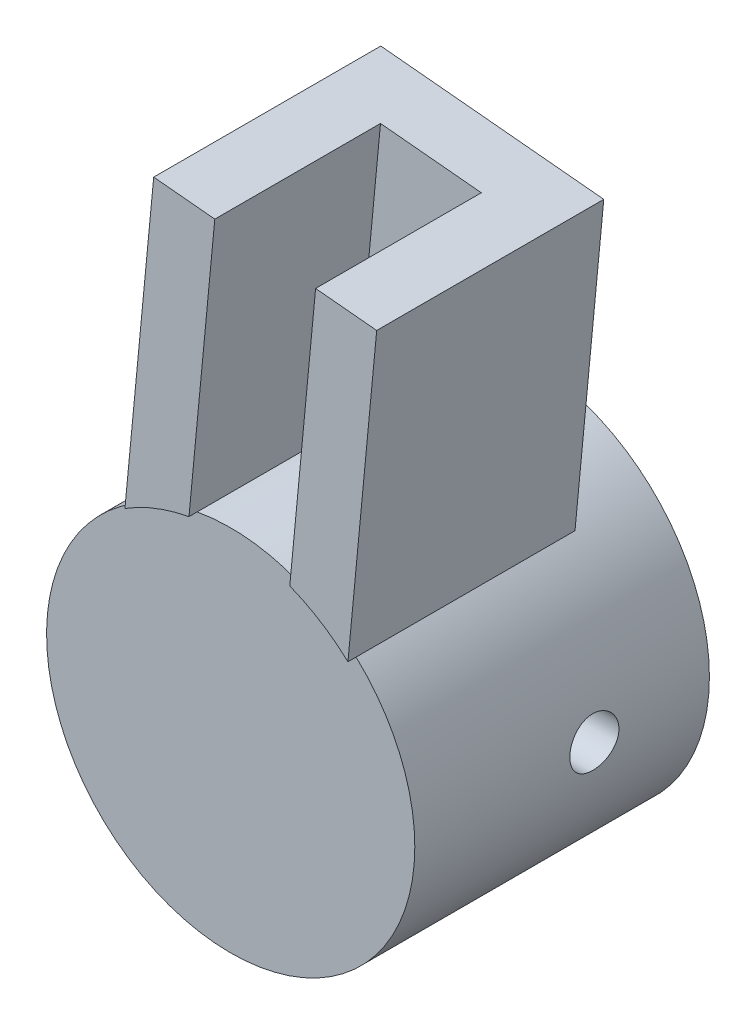
ISO-10303-21;
HEADER;
FILE_DESCRIPTION(('STEP AP214'),'2;1');
FILE_NAME('part.step','',(''),(''),'','','');
FILE_SCHEMA(('AUTOMOTIVE_DESIGN { 1 0 10303 214 1 1 1 1 }'));
ENDSEC;
DATA;
#1=APPLICATION_CONTEXT('core data for automotive mechanical design processes');
#2=APPLICATION_PROTOCOL_DEFINITION('international standard','automotive_design',2000,#1);
#3=PRODUCT_CONTEXT('',#1,'mechanical');
#4=PRODUCT('Part','Part','',(#3));
#5=PRODUCT_RELATED_PRODUCT_CATEGORY('part','',(#4));
#6=PRODUCT_DEFINITION_FORMATION('','',#4);
#7=PRODUCT_DEFINITION_CONTEXT('part definition',#1,'design');
#8=PRODUCT_DEFINITION('design','',#6,#7);
#9=PRODUCT_DEFINITION_SHAPE('','',#8);
#10=(LENGTH_UNIT() NAMED_UNIT(*) SI_UNIT(.MILLI.,.METRE.));
#11=(NAMED_UNIT(*) PLANE_ANGLE_UNIT() SI_UNIT($,.RADIAN.));
#12=(NAMED_UNIT(*) SI_UNIT($,.STERADIAN.) SOLID_ANGLE_UNIT());
#13=UNCERTAINTY_MEASURE_WITH_UNIT(LENGTH_MEASURE(1.E-05),#10,'distance_accuracy_value','');
#14=(GEOMETRIC_REPRESENTATION_CONTEXT(3) GLOBAL_UNCERTAINTY_ASSIGNED_CONTEXT((#13)) GLOBAL_UNIT_ASSIGNED_CONTEXT((#10,
#11,#12)) REPRESENTATION_CONTEXT('',''));
#15=CARTESIAN_POINT('',(0.,0.,0.));
#16=DIRECTION('',(0.,0.,1.));
#17=DIRECTION('',(1.,0.,0.));
#18=AXIS2_PLACEMENT_3D('',#15,#16,#17);
#19=CARTESIAN_POINT('',(0.,0.,-15.));
#20=DIRECTION('',(0.,0.,1.));
#21=DIRECTION('',(1.,0.,0.));
#22=AXIS2_PLACEMENT_3D('',#19,#20,#21);
#23=CYLINDRICAL_SURFACE('',#22,12.);
#24=DIRECTION('',(0.,0.,1.));
#25=VECTOR('',#24,1.);
#26=CARTESIAN_POINT('',(8.1720854308341,8.78732153225025,-15.));
#27=LINE('',#26,#25);
#28=CARTESIAN_POINT('',(8.1720854308341,8.78732153225025,4.2));
#29=VERTEX_POINT('',#28);
#30=CARTESIAN_POINT('',(8.1720854308341,8.78732153225026,-10.0688828783374));
#31=VERTEX_POINT('',#30);
#32=EDGE_CURVE('E325',#29,#31,#27,.F.);
#33=ORIENTED_EDGE('',*,*,#32,.F.);
#34=CARTESIAN_POINT('',(0.,0.,4.2));
#35=DIRECTION('',(0.,0.,1.));
#36=DIRECTION('',(1.,0.,0.));
#37=AXIS2_PLACEMENT_3D('',#34,#35,#36);
#38=CIRCLE('',#37,12.);
#39=CARTESIAN_POINT('',(-6.36183471373267,10.1748247687685,4.2));
#40=VERTEX_POINT('',#39);
#41=EDGE_CURVE('E276',#40,#29,#38,.T.);
#42=ORIENTED_EDGE('',*,*,#41,.F.);
#43=DIRECTION('',(0.,0.,1.));
#44=VECTOR('',#43,1.);
#45=CARTESIAN_POINT('',(-6.36183471373267,10.1748247687685,-15.));
#46=LINE('',#45,#44);
#47=CARTESIAN_POINT('',(-6.36183471373267,10.1748247687685,-10.0688828783374));
#48=VERTEX_POINT('',#47);
#49=EDGE_CURVE('E62',#48,#40,#46,.T.);
#50=ORIENTED_EDGE('',*,*,#49,.F.);
#51=CARTESIAN_POINT('',(0.,0.,-10.0688828783374));
#52=DIRECTION('',(0.,0.,1.));
#53=DIRECTION('',(0.,-1.,0.));
#54=AXIS2_PLACEMENT_3D('',#51,#52,#53);
#55=CIRCLE('',#54,12.);
#56=EDGE_CURVE('E324',#31,#48,#55,.T.);
#57=ORIENTED_EDGE('',*,*,#56,.F.);
#58=EDGE_LOOP('',(#33,#42,#50,#57));
#59=FACE_BOUND('',#58,.T.);
#60=CARTESIAN_POINT('',(0.,0.,-15.));
#61=DIRECTION('',(0.,0.,1.));
#62=DIRECTION('',(1.,0.,0.));
#63=AXIS2_PLACEMENT_3D('',#60,#61,#62);
#64=CIRCLE('',#63,12.);
#65=CARTESIAN_POINT('',(12.,0.,-15.));
#66=VERTEX_POINT('',#65);
#67=EDGE_CURVE('E48',#66,#66,#64,.T.);
#68=ORIENTED_EDGE('',*,*,#67,.T.);
#69=EDGE_LOOP('',(#68));
#70=FACE_BOUND('',#69,.T.);
#71=CARTESIAN_POINT('',(12.,0.,-5.90368821812988));
#72=CARTESIAN_POINT('',(11.9999986859404,0.0894470685354275,-5.90369198589541));
#73=CARTESIAN_POINT('',(11.9989893658175,0.178948783421024,-5.91121424849985));
#74=CARTESIAN_POINT('',(11.9950600890152,0.355458180110463,-5.94110129736953));
#75=CARTESIAN_POINT('',(11.9921381795338,0.442463217866429,-5.9634812540476));
#76=CARTESIAN_POINT('',(11.9847126387925,0.611398650101587,-6.02240959216304));
#77=CARTESIAN_POINT('',(11.9802101136878,0.693332546446795,-6.05894806696063));
#78=CARTESIAN_POINT('',(11.9701230932831,0.84989111602424,-6.1451337491749));
#79=CARTESIAN_POINT('',(11.9645387724685,0.92451696506962,-6.19477884306305));
#80=CARTESIAN_POINT('',(11.9528719583197,1.06482065800374,-6.30609882741322));
#81=CARTESIAN_POINT('',(11.9467868652969,1.13044638839669,-6.36783913413665));
#82=CARTESIAN_POINT('',(11.9348251004636,1.25043788538481,-6.5014563693912));
#83=CARTESIAN_POINT('',(11.9289484396987,1.30480305597777,-6.57333383412652));
#84=CARTESIAN_POINT('',(11.9180434835215,1.40092721815126,-6.7255275164859));
#85=CARTESIAN_POINT('',(11.9130185421261,1.44263685986062,-6.80587516411278));
#86=CARTESIAN_POINT('',(11.9044206990339,1.51195076005832,-6.97251307191931));
#87=CARTESIAN_POINT('',(11.9008477348097,1.53955562596222,-7.05880307601253));
#88=CARTESIAN_POINT('',(11.8955834925493,1.57971685417739,-7.2343328665312));
#89=CARTESIAN_POINT('',(11.8938811629611,1.59236163382805,-7.32355208575621));
#90=CARTESIAN_POINT('',(11.8925172128745,1.60251744438494,-7.50286116181464));
#91=CARTESIAN_POINT('',(11.8928554993632,1.60002916506881,-7.5929509787786));
#92=CARTESIAN_POINT('',(11.8955244461839,1.58006196751388,-7.77082512215222));
#93=CARTESIAN_POINT('',(11.8978421169787,1.56268078025409,-7.85862064203844));
#94=CARTESIAN_POINT('',(11.904188422198,1.51357379707497,-8.03003768753795));
#95=CARTESIAN_POINT('',(11.908217095633,1.48184767409166,-8.11365911793389));
#96=CARTESIAN_POINT('',(11.9175460888882,1.40484743314553,-8.27465592589563));
#97=CARTESIAN_POINT('',(11.9228503529912,1.35953118330999,-8.35201091508532));
#98=CARTESIAN_POINT('',(11.9341298897595,1.25666714675431,-8.49805548366401));
#99=CARTESIAN_POINT('',(11.9401051973082,1.19911872401908,-8.56674461217321));
#100=CARTESIAN_POINT('',(11.9521111938687,1.0728839202109,-8.69407462819539));
#101=CARTESIAN_POINT('',(11.9581419483296,1.00411336562116,-8.75263209229174));
#102=CARTESIAN_POINT('',(11.9695353905461,0.857675336106725,-8.85738585407259));
#103=CARTESIAN_POINT('',(11.9748980763772,0.780007835553895,-8.90358211614869));
#104=CARTESIAN_POINT('',(11.9843551499486,0.617913775784376,-8.98230351228567));
#105=CARTESIAN_POINT('',(11.9884490176717,0.533484463072984,-9.01482304296693));
#106=CARTESIAN_POINT('',(11.9949026072326,0.360296739468999,-9.06519967330775));
#107=CARTESIAN_POINT('',(11.9972624215194,0.271538559633805,-9.08305755464139));
#108=CARTESIAN_POINT('',(11.9999699310149,0.0929335226605146,-9.10349496434677));
#109=CARTESIAN_POINT('',(12.0003327507924,0.00310002763763347,-9.10618933955667));
#110=CARTESIAN_POINT('',(11.9990463323082,-0.175737293774975,-9.09652688682813));
#111=CARTESIAN_POINT('',(11.9973971429488,-0.264741140276532,-9.08417042470399));
#112=CARTESIAN_POINT('',(11.9922814028648,-0.439050972458351,-9.04485249542269));
#113=CARTESIAN_POINT('',(11.9888217144234,-0.524369613209637,-9.01794616347216));
#114=CARTESIAN_POINT('',(11.9804720740343,-0.689284079034848,-8.95034984538021));
#115=CARTESIAN_POINT('',(11.9755820675155,-0.768879685612511,-8.90965933331928));
#116=CARTESIAN_POINT('',(11.9648786989606,-0.920599102892863,-8.81537449366323));
#117=CARTESIAN_POINT('',(11.9590601203657,-0.992676651517283,-8.76170632555921));
#118=CARTESIAN_POINT('',(11.9471658296799,-1.12684235759352,-8.64309355475047));
#119=CARTESIAN_POINT('',(11.941090105925,-1.18893006129903,-8.57814844011673));
#120=CARTESIAN_POINT('',(11.9293192197881,-1.30176439538478,-8.43831770401824));
#121=CARTESIAN_POINT('',(11.9236267902024,-1.35243462087151,-8.36337016473935));
#122=CARTESIAN_POINT('',(11.9133130640145,-1.44046680863051,-8.20596068990514));
#123=CARTESIAN_POINT('',(11.9086917434943,-1.47782906808277,-8.12349892220158));
#124=CARTESIAN_POINT('',(11.9010624942406,-1.53806269200597,-7.95364242450772));
#125=CARTESIAN_POINT('',(11.8980498738608,-1.56097623077436,-7.86626286996124));
#126=CARTESIAN_POINT('',(11.8939659895863,-1.59179733715167,-7.68885331242687));
#127=CARTESIAN_POINT('',(11.8928946218507,-1.59970570741425,-7.59882345147033));
#128=CARTESIAN_POINT('',(11.8928178503636,-1.60027588644951,-7.41942942544707));
#129=CARTESIAN_POINT('',(11.8937961782602,-1.59305775355594,-7.33006562535848));
#130=CARTESIAN_POINT('',(11.8976734709936,-1.56383501349351,-7.15383391804678));
#131=CARTESIAN_POINT('',(11.9005724351106,-1.54183041186615,-7.0669660098883));
#132=CARTESIAN_POINT('',(11.9079591221821,-1.48369848265766,-6.89821327152861));
#133=CARTESIAN_POINT('',(11.9124461012752,-1.44757776655233,-6.81632612923639));
#134=CARTESIAN_POINT('',(11.9225043657026,-1.3622507420779,-6.65975551106903));
#135=CARTESIAN_POINT('',(11.9280756719728,-1.31304418104343,-6.58507217432504));
#136=CARTESIAN_POINT('',(11.9397277374645,-1.20249958807607,-6.44441649818715));
#137=CARTESIAN_POINT('',(11.9458120460327,-1.14107221781521,-6.37851465992578));
#138=CARTESIAN_POINT('',(11.9577737520133,-1.00801735479859,-6.25790964504064));
#139=CARTESIAN_POINT('',(11.9636511005518,-0.93638747258382,-6.20320909912968));
#140=CARTESIAN_POINT('',(11.9745650811002,-0.784602390282258,-6.10635450735666));
#141=CARTESIAN_POINT('',(11.9795979714151,-0.704411696595172,-6.06425568488568));
#142=CARTESIAN_POINT('',(11.9882185652718,-0.538073927669863,-5.99418373929382));
#143=CARTESIAN_POINT('',(11.9918078153945,-0.451933343175911,-5.96619549122999));
#144=CARTESIAN_POINT('',(11.9962857739461,-0.304470726478735,-5.93172981302173));
#145=CARTESIAN_POINT('',(11.9976717090806,-0.244072865564623,-5.92122962331097));
#146=CARTESIAN_POINT('',(11.9995292679262,-0.122458537292889,-5.9072075667975));
#147=CARTESIAN_POINT('',(12.0000008997024,-0.0612420771609921,-5.903685638439));
#148=CARTESIAN_POINT('',(12.,0.,-5.90368821812988));
#149=B_SPLINE_CURVE_WITH_KNOTS('',3,(#71,#72,#73,#74,#75,#76,#77,#78,#79,#80,#81,#82,#83,#84,
#85,#86,#87,#88,#89,#90,#91,#92,#93,#94,#95,#96,#97,#98,#99,#100,#101,#102,#103,#104,#105,#106,
#107,#108,#109,#110,#111,#112,#113,#114,#115,#116,#117,#118,#119,#120,#121,#122,#123,#124,#125,
#126,#127,#128,#129,#130,#131,#132,#133,#134,#135,#136,#137,#138,#139,#140,#141,#142,#143,#144,
#145,#146,#147,#148),.UNSPECIFIED.,.T.,.F.,(4,2,2,2,2,2,2,2,2,2,2,2,2,2,2,2,2,2,2,2,2,2,2,2,2,2,
2,2,2,2,2,2,2,2,2,2,2,2,4),(0.,0.268117481044595,0.536509144708036,0.804713354261924,
1.07287434051228,1.34252782754847,1.61219558323869,1.88290177209318,2.15359630212964,
2.42268284731487,2.69175712739936,2.95907908078435,3.2264071294068,3.49457266510318,
3.76275214755038,4.0330443558788,4.30333734281837,4.57374096162031,4.84413016313394,
5.11246867993649,5.38080067483583,5.64812290717171,5.91545534002837,6.18434619815907,
6.45324926607009,6.7239016362836,6.99454796218438,7.26440059788363,7.53423879826907,
7.80194341997299,8.06964794134996,8.33722722962097,8.60481168476722,8.87442934268086,
9.14411025000928,9.41495621339612,9.68551123993935,9.86908591237847,10.0526589654835),.UNSPECIFIED.);
#150=CARTESIAN_POINT('',(12.,0.,-5.90368821812988));
#151=VERTEX_POINT('',#150);
#152=EDGE_CURVE('E346',#151,#151,#149,.T.);
#153=ORIENTED_EDGE('',*,*,#152,.T.);
#154=EDGE_LOOP('',(#153));
#155=FACE_BOUND('',#154,.T.);
#156=ADVANCED_FACE('F33',(#59,#70,#155),#23,.T.);
#157=CARTESIAN_POINT('',(2.59506882314704,1.40289621965782,-15.));
#158=DIRECTION('',(0.,0.,1.));
#159=DIRECTION('',(1.,0.,0.));
#160=AXIS2_PLACEMENT_3D('',#157,#158,#159);
#161=CYLINDRICAL_SURFACE('',#160,0.3);
#162=CARTESIAN_POINT('',(2.75946431746555,1.15194976830261,-6.39327760429932));
#163=CARTESIAN_POINT('',(2.7746767678414,1.16193525080341,-6.40361676036275));
#164=CARTESIAN_POINT('',(2.78827729134065,1.17279693507369,-6.41518183741303));
#165=CARTESIAN_POINT('',(2.81237823749915,1.19541685315132,-6.44008776803489));
#166=CARTESIAN_POINT('',(2.82291612937795,1.20716182461453,-6.45340398461847));
#167=CARTESIAN_POINT('',(2.84496355069555,1.23559176569461,-6.48684722325038));
#168=CARTESIAN_POINT('',(2.85527224684981,1.25243028620813,-6.50761634783486));
#169=CARTESIAN_POINT('',(2.87190295302287,1.285797818403,-6.5510686860482));
#170=CARTESIAN_POINT('',(2.8781987136833,1.30232411961801,-6.57376342398952));
#171=CARTESIAN_POINT('',(2.89078814595847,1.34515786351887,-6.6360617824531));
#172=CARTESIAN_POINT('',(2.89425723444188,1.37060438492242,-6.67681145866452));
#173=CARTESIAN_POINT('',(2.89562621059773,1.41772464271077,-6.76046265024144));
#174=CARTESIAN_POINT('',(2.89351461015878,1.43939049859279,-6.80336842576743));
#175=CARTESIAN_POINT('',(2.88639368586659,1.47674153601098,-6.88635988206748));
#176=CARTESIAN_POINT('',(2.881691467718,1.49280621983811,-6.92630502732523));
#177=CARTESIAN_POINT('',(2.8709986102756,1.52163607456236,-7.0072289353207));
#178=CARTESIAN_POINT('',(2.86500677853318,1.53439816748294,-7.04820862348756));
#179=CARTESIAN_POINT('',(2.85303024727602,1.55656482952637,-7.13094817689768));
#180=CARTESIAN_POINT('',(2.84704557112873,1.5659782318314,-7.17270567919916));
#181=CARTESIAN_POINT('',(2.83633403570577,1.58144612610228,-7.25698579762661));
#182=CARTESIAN_POINT('',(2.83160649189326,1.58750244803051,-7.29950798384149));
#183=CARTESIAN_POINT('',(2.8244659977343,1.59631757959155,-7.38647812519831));
#184=CARTESIAN_POINT('',(2.82213107992271,1.59896589992728,-7.43094442377641));
#185=CARTESIAN_POINT('',(2.82076763093374,1.60053635424563,-7.51999332329119));
#186=CARTESIAN_POINT('',(2.82173876001382,1.59945887110647,-7.56457591180698));
#187=CARTESIAN_POINT('',(2.82668633681235,1.59359652841673,-7.65350710511275));
#188=CARTESIAN_POINT('',(2.83067569563277,1.58879573943458,-7.6978538781657));
#189=CARTESIAN_POINT('',(2.84053455919664,1.57556209555856,-7.78579926382878));
#190=CARTESIAN_POINT('',(2.84640592103017,1.5671256502911,-7.8293970924496));
#191=CARTESIAN_POINT('',(2.86279451687639,1.53973114608603,-7.94501593738655));
#192=CARTESIAN_POINT('',(2.87376077817449,1.5175180612063,-8.016249037357));
#193=CARTESIAN_POINT('',(2.88615818626323,1.47683096603998,-8.12041262767478));
#194=CARTESIAN_POINT('',(2.88961117877759,1.46209325156849,-8.15459220028531));
#195=CARTESIAN_POINT('',(2.89425810342656,1.43020204971961,-8.22195475030783));
#196=CARTESIAN_POINT('',(2.89545455166769,1.41305127593394,-8.255138797063));
#197=CARTESIAN_POINT('',(2.89455587606245,1.37991557538487,-8.31409071240726));
#198=CARTESIAN_POINT('',(2.89303655263434,1.36431629446698,-8.34008125954398));
#199=CARTESIAN_POINT('',(2.88698536118362,1.33176491608092,-8.39099645627279));
#200=CARTESIAN_POINT('',(2.8824437102843,1.31480858332788,-8.41591736381894));
#201=CARTESIAN_POINT('',(2.8692870679788,1.27976531471265,-8.46447441462399));
#202=CARTESIAN_POINT('',(2.86061117095515,1.26166510500089,-8.48808525090175));
#203=CARTESIAN_POINT('',(2.83799963256982,1.225607134339,-8.53261604909932));
#204=CARTESIAN_POINT('',(2.82410762280186,1.2076494200368,-8.55355645375934));
#205=CARTESIAN_POINT('',(2.80021428350507,1.18378638893839,-8.58014458911014));
#206=CARTESIAN_POINT('',(2.79284048163556,1.177085361924,-8.58745944198274));
#207=CARTESIAN_POINT('',(2.77698839921905,1.164127083688,-8.60136703669942));
#208=CARTESIAN_POINT('',(2.76850391283389,1.15787265633601,-8.60795530625074));
#209=CARTESIAN_POINT('',(2.75946431746555,1.15194976830261,-8.61409883196044));
#210=B_SPLINE_CURVE_WITH_KNOTS('',3,(#162,#163,#164,#165,#166,#167,#168,#169,#170,#171,#172,
#173,#174,#175,#176,#177,#178,#179,#180,#181,#182,#183,#184,#185,#186,#187,#188,#189,#190,#191,
#192,#193,#194,#195,#196,#197,#198,#199,#200,#201,#202,#203,#204,#205,#206,#207,#208,#209),
.UNSPECIFIED.,.F.,.F.,(4,2,2,2,2,2,2,2,2,2,2,2,2,2,2,2,2,2,2,2,2,2,2,4),(0.,0.0624570671490309,
0.12411431528086,0.209620964874805,0.295681339902772,0.439371730600441,0.583358145024842,
0.713110085790475,0.84298252185812,0.972509794588095,1.10196639170389,1.23552226940227,
1.36906442278114,1.50318108315117,1.63743049434247,1.86277797722993,1.97481274296579,
2.08672251295121,2.17762190736499,2.26881697167505,2.3613991312792,2.45322351702526,
2.49023578608566,2.52746446742832),.UNSPECIFIED.);
#211=CARTESIAN_POINT('',(2.75946431746555,1.15194976830261,-6.39327760429932));
#212=VERTEX_POINT('',#211);
#213=CARTESIAN_POINT('',(2.75946431746555,1.15194976830261,-8.61409883196044));
#214=VERTEX_POINT('',#213);
#215=EDGE_CURVE('E352',#212,#214,#210,.T.);
#216=ORIENTED_EDGE('',*,*,#215,.F.);
#217=DIRECTION('',(0.,0.,1.));
#218=VECTOR('',#217,1.);
#219=CARTESIAN_POINT('',(2.75946431746555,1.15194976830261,-15.));
#220=LINE('',#219,#218);
#221=CARTESIAN_POINT('',(2.75946431746555,1.15194976830261,0.));
#222=VERTEX_POINT('',#221);
#223=EDGE_CURVE('E228',#212,#222,#220,.T.);
#224=ORIENTED_EDGE('',*,*,#223,.T.);
#225=CARTESIAN_POINT('',(2.59506882314704,1.40289621965782,0.));
#226=DIRECTION('',(0.,0.,1.));
#227=DIRECTION('',(-1.,0.,0.));
#228=AXIS2_PLACEMENT_3D('',#225,#226,#227);
#229=CIRCLE('',#228,0.3);
#230=CARTESIAN_POINT('',(2.61834360609124,1.70199199776059,0.));
#231=VERTEX_POINT('',#230);
#232=EDGE_CURVE('E230',#222,#231,#229,.T.);
#233=ORIENTED_EDGE('',*,*,#232,.T.);
#234=DIRECTION('',(0.,0.,1.));
#235=VECTOR('',#234,1.);
#236=CARTESIAN_POINT('',(2.61834360609124,1.70199199776059,-15.));
#237=LINE('',#236,#235);
#238=CARTESIAN_POINT('',(2.61834360609124,1.70199199776059,-15.));
#239=VERTEX_POINT('',#238);
#240=EDGE_CURVE('E217',#239,#231,#237,.T.);
#241=ORIENTED_EDGE('',*,*,#240,.F.);
#242=CARTESIAN_POINT('',(2.59506882314704,1.40289621965782,-15.));
#243=DIRECTION('',(0.,0.,1.));
#244=DIRECTION('',(-1.,0.,0.));
#245=AXIS2_PLACEMENT_3D('',#242,#243,#244);
#246=CIRCLE('',#245,0.3);
#247=CARTESIAN_POINT('',(2.75946431746555,1.15194976830261,-15.));
#248=VERTEX_POINT('',#247);
#249=EDGE_CURVE('E215',#248,#239,#246,.T.);
#250=ORIENTED_EDGE('',*,*,#249,.F.);
#251=EDGE_CURVE('E221',#248,#214,#220,.T.);
#252=ORIENTED_EDGE('',*,*,#251,.T.);
#253=EDGE_LOOP('',(#216,#224,#233,#241,#250,#252));
#254=FACE_BOUND('',#253,.T.);
#255=ADVANCED_FACE('F385',(#254),#161,.F.);
#256=CARTESIAN_POINT('',(3.0334568079964,0.733705682710598,-15.));
#257=DIRECTION('',(0.,0.,1.));
#258=DIRECTION('',(1.,0.,0.));
#259=AXIS2_PLACEMENT_3D('',#256,#257,#258);
#260=CYLINDRICAL_SURFACE('',#259,0.5);
#261=CARTESIAN_POINT('',(2.5357198167441,0.781222916837937,-6.10737494589931));
#262=CARTESIAN_POINT('',(2.53749626391485,0.799802599862538,-6.11776746376111));
#263=CARTESIAN_POINT('',(2.54028768684944,0.818077426186611,-6.12848211643603));
#264=CARTESIAN_POINT('',(2.54777154791528,0.853892244746506,-6.15043002253066));
#265=CARTESIAN_POINT('',(2.55246235052131,0.871432854902287,-6.16166282242716));
#266=CARTESIAN_POINT('',(2.56921550824171,0.922866639269812,-6.196013691193));
#267=CARTESIAN_POINT('',(2.58395229722303,0.955513172383166,-6.21975111433859));
#268=CARTESIAN_POINT('',(2.61774205860706,1.01330662085204,-6.2649748984253));
#269=CARTESIAN_POINT('',(2.63613559350459,1.03888371407988,-6.28641914767344));
#270=CARTESIAN_POINT('',(2.67764500483524,1.08639592404234,-6.328639052954));
#271=CARTESIAN_POINT('',(2.70074425106891,1.1083433863211,-6.34941677317545));
#272=CARTESIAN_POINT('',(2.73689717228961,1.13648576774551,-6.37739190231247));
#273=CARTESIAN_POINT('',(2.74797062845834,1.14441309690858,-6.38545358308547));
#274=CARTESIAN_POINT('',(2.75946431746552,1.15194976830263,-6.39327760429934));
#275=B_SPLINE_CURVE_WITH_KNOTS('',3,(#261,#262,#263,#264,#265,#266,#267,#268,#269,#270,#271,
#272,#273,#274),.UNSPECIFIED.,.F.,.F.,(4,2,2,2,2,2,4),(0.,0.0640178994513357,0.127980790952367,
0.256106107086745,0.370030303271433,0.483558661045447,0.530996853306031),.UNSPECIFIED.);
#276=CARTESIAN_POINT('',(2.5357198167441,0.781222916837937,-6.10737494589932));
#277=VERTEX_POINT('',#276);
#278=EDGE_CURVE('E375',#277,#212,#275,.T.);
#279=ORIENTED_EDGE('',*,*,#278,.F.);
#280=DIRECTION('',(0.,0.,1.));
#281=VECTOR('',#280,1.);
#282=CARTESIAN_POINT('',(2.5357198167441,0.781222916837937,-15.));
#283=LINE('',#282,#281);
#284=CARTESIAN_POINT('',(2.5357198167441,0.781222916837937,0.));
#285=VERTEX_POINT('',#284);
#286=EDGE_CURVE('E192',#277,#285,#283,.T.);
#287=ORIENTED_EDGE('',*,*,#286,.T.);
#288=CARTESIAN_POINT('',(3.0334568079964,0.733705682710598,0.));
#289=DIRECTION('',(0.,0.,-1.));
#290=DIRECTION('',(1.,0.,0.));
#291=AXIS2_PLACEMENT_3D('',#288,#289,#290);
#292=CIRCLE('',#291,0.5);
#293=EDGE_CURVE('E233',#285,#222,#292,.T.);
#294=ORIENTED_EDGE('',*,*,#293,.T.);
#295=ORIENTED_EDGE('',*,*,#223,.F.);
#296=EDGE_LOOP('',(#279,#287,#294,#295));
#297=FACE_BOUND('',#296,.T.);
#298=ADVANCED_FACE('F380',(#297),#260,.T.);
#299=CARTESIAN_POINT('',(2.75946431746555,1.15194976830261,-8.61409883196044));
#300=CARTESIAN_POINT('',(2.74395868313148,1.14178026470308,-8.62465223122033));
#301=CARTESIAN_POINT('',(2.7292391079611,1.13091644924202,-8.63562849872275));
#302=CARTESIAN_POINT('',(2.70134122973392,1.10790917521996,-8.65815556391831));
#303=CARTESIAN_POINT('',(2.68816169749797,1.09576675209691,-8.66970589278461));
#304=CARTESIAN_POINT('',(2.65076792911979,1.05747284489675,-8.70491732309708));
#305=CARTESIAN_POINT('',(2.62880216520461,1.0295243710828,-8.72906444500524));
#306=CARTESIAN_POINT('',(2.59298699695987,0.972467791014803,-8.77471737847449));
#307=CARTESIAN_POINT('',(2.57855353390754,0.943741075467496,-8.79625034058581));
#308=CARTESIAN_POINT('',(2.55531944267853,0.883441344686851,-8.8381785327209));
#309=CARTESIAN_POINT('',(2.54649631421974,0.851880285766536,-8.85857800409676));
#310=CARTESIAN_POINT('',(2.53865369097824,0.806725482580936,-8.8855033816931));
#311=CARTESIAN_POINT('',(2.53694322121512,0.794041362800518,-8.89283391787598));
#312=CARTESIAN_POINT('',(2.5357198167441,0.781222916837938,-8.90000149036044));
#313=B_SPLINE_CURVE_WITH_KNOTS('',3,(#299,#300,#301,#302,#303,#304,#305,#306,#307,#308,#309,
#310,#311,#312),.UNSPECIFIED.,.F.,.F.,(4,2,2,2,2,2,4),(0.,0.0639257086740603,0.127800041661756,
0.255978227584562,0.371607903258545,0.486770870909055,0.530985428326668),.UNSPECIFIED.);
#314=CARTESIAN_POINT('',(2.5357198167441,0.781222916837937,-8.90000149036045));
#315=VERTEX_POINT('',#314);
#316=EDGE_CURVE('E193',#214,#315,#313,.T.);
#317=ORIENTED_EDGE('',*,*,#316,.F.);
#318=ORIENTED_EDGE('',*,*,#251,.F.);
#319=CARTESIAN_POINT('',(3.0334568079964,0.733705682710598,-15.));
#320=DIRECTION('',(0.,0.,-1.));
#321=DIRECTION('',(1.,0.,0.));
#322=AXIS2_PLACEMENT_3D('',#319,#320,#321);
#323=CIRCLE('',#322,0.5);
#324=CARTESIAN_POINT('',(2.5357198167441,0.781222916837937,-15.));
#325=VERTEX_POINT('',#324);
#326=EDGE_CURVE('E253',#325,#248,#323,.T.);
#327=ORIENTED_EDGE('',*,*,#326,.F.);
#328=EDGE_CURVE('E205',#325,#315,#283,.T.);
#329=ORIENTED_EDGE('',*,*,#328,.T.);
#330=EDGE_LOOP('',(#317,#318,#327,#329));
#331=FACE_BOUND('',#330,.T.);
#332=ADVANCED_FACE('F384',(#331),#260,.T.);
#333=CARTESIAN_POINT('',(2.49976300784357,0.404579911287017,-15.));
#334=DIRECTION('',(0.995473982504591,-0.0950344682546789,0.));
#335=DIRECTION('',(0.0950344682546789,0.995473982504591,0.));
#336=AXIS2_PLACEMENT_3D('',#333,#334,#335);
#337=PLANE('',#336);
#338=CARTESIAN_POINT('',(2.46113915889178,0.,-7.50368821812988));
#339=DIRECTION('',(0.995473982504591,-0.0950344682546789,0.));
#340=DIRECTION('',(-0.0950344682546789,-0.995473982504591,0.));
#341=AXIS2_PLACEMENT_3D('',#338,#339,#340);
#342=ELLIPSE('',#341,1.60727455274565,1.6);
#343=CARTESIAN_POINT('',(2.34210269752839,-1.24689181128589,-6.50106126310214));
#344=VERTEX_POINT('',#343);
#345=EDGE_CURVE('E181',#344,#277,#342,.F.);
#346=ORIENTED_EDGE('',*,*,#345,.F.);
#347=DIRECTION('',(0.,0.,1.));
#348=VECTOR('',#347,1.);
#349=CARTESIAN_POINT('',(2.34210269752839,-1.24689181128589,-15.));
#350=LINE('',#349,#348);
#351=CARTESIAN_POINT('',(2.34210269752839,-1.24689181128589,0.));
#352=VERTEX_POINT('',#351);
#353=EDGE_CURVE('E190',#344,#352,#350,.T.);
#354=ORIENTED_EDGE('',*,*,#353,.T.);
#355=DIRECTION('',(0.0950344682546789,0.995473982504591,0.));
#356=VECTOR('',#355,1.);
#357=CARTESIAN_POINT('',(2.49976300784357,0.404579911287017,0.));
#358=LINE('',#357,#356);
#359=EDGE_CURVE('E236',#352,#285,#358,.T.);
#360=ORIENTED_EDGE('',*,*,#359,.T.);
#361=ORIENTED_EDGE('',*,*,#286,.F.);
#362=EDGE_LOOP('',(#346,#354,#360,#361));
#363=FACE_BOUND('',#362,.T.);
#364=ADVANCED_FACE('F188',(#363),#337,.F.);
#365=CARTESIAN_POINT('',(2.83983968878069,-1.29440904541323,-15.));
#366=DIRECTION('',(0.,0.,1.));
#367=DIRECTION('',(1.,0.,0.));
#368=AXIS2_PLACEMENT_3D('',#365,#366,#367);
#369=CYLINDRICAL_SURFACE('',#368,0.5);
#370=CARTESIAN_POINT('',(2.34210269752839,-1.24689181128589,-8.50631517315762));
#371=CARTESIAN_POINT('',(2.34019513160829,-1.26698402105249,-8.48133610425382));
#372=CARTESIAN_POINT('',(2.33956213094219,-1.28633917462322,-8.4557203223085));
#373=CARTESIAN_POINT('',(2.34033669777117,-1.32342761402647,-8.40344371827052));
#374=CARTESIAN_POINT('',(2.34174001126126,-1.34116419895467,-8.37678518767189));
#375=CARTESIAN_POINT('',(2.34823859065903,-1.39181706743492,-8.29547353905498));
#376=CARTESIAN_POINT('',(2.3556209429227,-1.42221190017544,-8.23944016116224));
#377=CARTESIAN_POINT('',(2.3767871078303,-1.48725536657727,-8.10049407410231));
#378=CARTESIAN_POINT('',(2.39195684932708,-1.51837206912139,-8.01613553224608));
#379=CARTESIAN_POINT('',(2.41240685497347,-1.55419571800448,-7.88642063930039));
#380=CARTESIAN_POINT('',(2.41883747481441,-1.56432662827974,-7.84266955159488));
#381=CARTESIAN_POINT('',(2.42993013389816,-1.58089566305517,-7.75426327960123));
#382=CARTESIAN_POINT('',(2.43459365104122,-1.58733687571806,-7.70960888386212));
#383=CARTESIAN_POINT('',(2.44127315978439,-1.59636384109897,-7.62033561784012));
#384=CARTESIAN_POINT('',(2.44332493024308,-1.59900176395635,-7.57572482372713));
#385=CARTESIAN_POINT('',(2.44450284754368,-1.60052987994847,-7.48639884710541));
#386=CARTESIAN_POINT('',(2.44362911466994,-1.5994202271677,-7.44168366896405));
#387=CARTESIAN_POINT('',(2.43912255171087,-1.59347254398789,-7.35253608846387));
#388=CARTESIAN_POINT('',(2.43548270876861,-1.58862503663142,-7.3081046947634));
#389=CARTESIAN_POINT('',(2.42610568762267,-1.57528186912283,-7.22000866772796));
#390=CARTESIAN_POINT('',(2.42036716290401,-1.56678386619893,-7.17634454556691));
#391=CARTESIAN_POINT('',(2.40339886095428,-1.53921953160797,-7.0605349384703));
#392=CARTESIAN_POINT('',(2.39109589067986,-1.51689942201912,-6.98931047632069));
#393=CARTESIAN_POINT('',(2.36804497481229,-1.4625704975202,-6.85069321547988));
#394=CARTESIAN_POINT('',(2.35729083072469,-1.43060198321371,-6.78328583792529));
#395=CARTESIAN_POINT('',(2.345500046185,-1.37253660790047,-6.6802635980675));
#396=CARTESIAN_POINT('',(2.34228030188339,-1.34957666315513,-6.64314374912345));
#397=CARTESIAN_POINT('',(2.33927873136137,-1.30052531707377,-6.57064420060697));
#398=CARTESIAN_POINT('',(2.33951365968239,-1.27441926413826,-6.53527381687853));
#399=CARTESIAN_POINT('',(2.34210269752839,-1.24689181128589,-6.50106126310214));
#400=B_SPLINE_CURVE_WITH_KNOTS('',3,(#370,#371,#372,#373,#374,#375,#376,#377,#378,#379,#380,
#381,#382,#383,#384,#385,#386,#387,#388,#389,#390,#391,#392,#393,#394,#395,#396,#397,#398,#399),
.UNSPECIFIED.,.F.,.F.,(4,2,2,2,2,2,2,2,2,2,2,2,2,2,4),(0.,0.0962396514555316,0.192278540658961,
0.384188363815836,0.656310262272519,0.792270946368389,0.928117668682872,1.06208263353309,
1.19604209037632,1.33034230936026,1.46472884701481,1.6909227777159,1.91618469165605,
2.04722665314216,2.17890435331808),.UNSPECIFIED.);
#401=CARTESIAN_POINT('',(2.34210269752839,-1.24689181128589,-8.50631517315762));
#402=VERTEX_POINT('',#401);
#403=EDGE_CURVE('E11',#402,#344,#400,.T.);
#404=ORIENTED_EDGE('',*,*,#403,.F.);
#405=CARTESIAN_POINT('',(2.34210269752839,-1.24689181128589,-15.));
#406=VERTEX_POINT('',#405);
#407=EDGE_CURVE('E199',#406,#402,#350,.T.);
#408=ORIENTED_EDGE('',*,*,#407,.F.);
#409=CARTESIAN_POINT('',(2.83983968878069,-1.29440904541323,-15.));
#410=DIRECTION('',(0.,0.,-1.));
#411=DIRECTION('',(-1.,0.,0.));
#412=AXIS2_PLACEMENT_3D('',#409,#410,#411);
#413=CIRCLE('',#412,0.5);
#414=CARTESIAN_POINT('',(2.49166094024617,-1.65325658834607,-15.));
#415=VERTEX_POINT('',#414);
#416=EDGE_CURVE('E259',#415,#406,#413,.T.);
#417=ORIENTED_EDGE('',*,*,#416,.F.);
#418=DIRECTION('',(0.,0.,1.));
#419=VECTOR('',#418,1.);
#420=CARTESIAN_POINT('',(2.49166094024617,-1.65325658834607,-15.));
#421=LINE('',#420,#419);
#422=CARTESIAN_POINT('',(2.49166094024617,-1.65325658834607,0.));
#423=VERTEX_POINT('',#422);
#424=EDGE_CURVE('E200',#415,#423,#421,.T.);
#425=ORIENTED_EDGE('',*,*,#424,.T.);
#426=CARTESIAN_POINT('',(2.83983968878069,-1.29440904541323,0.));
#427=DIRECTION('',(0.,0.,-1.));
#428=DIRECTION('',(-1.,0.,0.));
#429=AXIS2_PLACEMENT_3D('',#426,#427,#428);
#430=CIRCLE('',#429,0.5);
#431=EDGE_CURVE('E198',#423,#352,#430,.T.);
#432=ORIENTED_EDGE('',*,*,#431,.T.);
#433=ORIENTED_EDGE('',*,*,#353,.F.);
#434=EDGE_LOOP('',(#404,#408,#417,#425,#432,#433));
#435=FACE_BOUND('',#434,.T.);
#436=ADVANCED_FACE('F196',(#435),#369,.T.);
#437=DIRECTION('',(0.,0.,1.));
#438=VECTOR('',#437,1.);
#439=CARTESIAN_POINT('',(-2.18862005279898,11.798726298397,-15.));
#440=LINE('',#439,#438);
#441=CARTESIAN_POINT('',(-2.18862005279898,11.798726298397,4.2));
#442=VERTEX_POINT('',#441);
#443=CARTESIAN_POINT('',(-2.18862005279898,11.798726298397,-6.06888287833737));
#444=VERTEX_POINT('',#443);
#445=EDGE_CURVE('E338',#442,#444,#440,.F.);
#446=ORIENTED_EDGE('',*,*,#445,.F.);
#447=CARTESIAN_POINT('',(4.38150823173106,11.1714988079162,4.2));
#448=VERTEX_POINT('',#447);
#449=EDGE_CURVE('E275',#448,#442,#38,.T.);
#450=ORIENTED_EDGE('',*,*,#449,.F.);
#451=DIRECTION('',(0.,0.,1.));
#452=VECTOR('',#451,1.);
#453=CARTESIAN_POINT('',(4.38150823173106,11.1714988079162,-15.));
#454=LINE('',#453,#452);
#455=CARTESIAN_POINT('',(4.38150823173106,11.1714988079162,-6.06888287833736));
#456=VERTEX_POINT('',#455);
#457=EDGE_CURVE('E328',#456,#448,#454,.T.);
#458=ORIENTED_EDGE('',*,*,#457,.F.);
#459=CARTESIAN_POINT('',(0.,0.,-6.06888287833737));
#460=DIRECTION('',(0.,0.,-1.));
#461=DIRECTION('',(-1.,0.,0.));
#462=AXIS2_PLACEMENT_3D('',#459,#460,#461);
#463=CIRCLE('',#462,12.);
#464=EDGE_CURVE('E332',#444,#456,#463,.T.);
#465=ORIENTED_EDGE('',*,*,#464,.F.);
#466=EDGE_LOOP('',(#446,#450,#458,#465));
#467=FACE_BOUND('',#466,.T.);
#468=ADVANCED_FACE('F35',(#467),#23,.T.);
#469=CARTESIAN_POINT('',(0.,0.,-15.));
#470=DIRECTION('',(0.,0.,1.));
#471=DIRECTION('',(1.,0.,0.));
#472=AXIS2_PLACEMENT_3D('',#469,#470,#471);
#473=PLANE('',#472);
#474=ORIENTED_EDGE('',*,*,#249,.T.);
#475=CARTESIAN_POINT('',(2.65713491099824,2.2004849612652,-15.));
#476=DIRECTION('',(0.,0.,-1.));
#477=DIRECTION('',(-1.,0.,0.));
#478=AXIS2_PLACEMENT_3D('',#475,#476,#477);
#479=CIRCLE('',#478,0.5);
#480=CARTESIAN_POINT('',(2.27204289491153,1.88157409731372,-15.));
#481=VERTEX_POINT('',#480);
#482=EDGE_CURVE('E232',#239,#481,#479,.T.);
#483=ORIENTED_EDGE('',*,*,#482,.T.);
#484=CARTESIAN_POINT('',(0.,0.,-15.));
#485=DIRECTION('',(0.,0.,1.));
#486=DIRECTION('',(1.,0.,0.));
#487=AXIS2_PLACEMENT_3D('',#484,#485,#486);
#488=CIRCLE('',#487,2.95);
#489=CARTESIAN_POINT('',(1.87499260269528,-2.27747727537247,-15.));
#490=VERTEX_POINT('',#489);
#491=EDGE_CURVE('E268',#481,#490,#488,.T.);
#492=ORIENTED_EDGE('',*,*,#491,.T.);
#493=CARTESIAN_POINT('',(2.19278795908431,-2.66349037289323,-15.));
#494=DIRECTION('',(0.,0.,-1.));
#495=DIRECTION('',(1.,0.,0.));
#496=AXIS2_PLACEMENT_3D('',#493,#494,#495);
#497=CIRCLE('',#496,0.5);
#498=CARTESIAN_POINT('',(2.24901654161003,-2.16666208615107,-15.));
#499=VERTEX_POINT('',#498);
#500=EDGE_CURVE('E265',#490,#499,#497,.T.);
#501=ORIENTED_EDGE('',*,*,#500,.T.);
#502=CARTESIAN_POINT('',(2.28275369112546,-1.86856511410577,-15.));
#503=DIRECTION('',(0.,0.,1.));
#504=DIRECTION('',(1.,0.,0.));
#505=AXIS2_PLACEMENT_3D('',#502,#503,#504);
#506=CIRCLE('',#505,0.299999999999999);
#507=EDGE_CURVE('E262',#499,#415,#506,.T.);
#508=ORIENTED_EDGE('',*,*,#507,.T.);
#509=ORIENTED_EDGE('',*,*,#416,.T.);
#510=DIRECTION('',(0.0950344682546791,0.995473982504591,0.));
#511=VECTOR('',#510,1.);
#512=CARTESIAN_POINT('',(2.34210269752839,-1.24689181128589,-15.));
#513=LINE('',#512,#511);
#514=EDGE_CURVE('E256',#406,#325,#513,.T.);
#515=ORIENTED_EDGE('',*,*,#514,.T.);
#516=ORIENTED_EDGE('',*,*,#326,.T.);
#517=EDGE_LOOP('',(#474,#483,#492,#501,#508,#509,#515,#516));
#518=FACE_BOUND('',#517,.T.);
#519=ORIENTED_EDGE('',*,*,#67,.F.);
#520=EDGE_LOOP('',(#519));
#521=FACE_BOUND('',#520,.T.);
#522=ADVANCED_FACE('F411',(#518,#521),#473,.F.);
#523=CARTESIAN_POINT('',(2.65713491099824,2.2004849612652,-15.));
#524=DIRECTION('',(0.,0.,1.));
#525=DIRECTION('',(1.,0.,0.));
#526=AXIS2_PLACEMENT_3D('',#523,#524,#525);
#527=CYLINDRICAL_SURFACE('',#526,0.5);
#528=CARTESIAN_POINT('',(2.65713491099824,2.2004849612652,0.));
#529=DIRECTION('',(0.,0.,-1.));
#530=DIRECTION('',(-1.,0.,0.));
#531=AXIS2_PLACEMENT_3D('',#528,#529,#530);
#532=CIRCLE('',#531,0.5);
#533=CARTESIAN_POINT('',(2.27204289491153,1.88157409731372,0.));
#534=VERTEX_POINT('',#533);
#535=EDGE_CURVE('E248',#231,#534,#532,.T.);
#536=ORIENTED_EDGE('',*,*,#535,.T.);
#537=DIRECTION('',(0.,0.,1.));
#538=VECTOR('',#537,1.);
#539=CARTESIAN_POINT('',(2.27204289491153,1.88157409731372,-15.));
#540=LINE('',#539,#538);
#541=EDGE_CURVE('E213',#481,#534,#540,.T.);
#542=ORIENTED_EDGE('',*,*,#541,.F.);
#543=ORIENTED_EDGE('',*,*,#482,.F.);
#544=ORIENTED_EDGE('',*,*,#240,.T.);
#545=EDGE_LOOP('',(#536,#542,#543,#544));
#546=FACE_BOUND('',#545,.T.);
#547=ADVANCED_FACE('F393',(#546),#527,.T.);
#548=EDGE_CURVE('E54',#315,#402,#342,.F.);
#549=ORIENTED_EDGE('',*,*,#548,.F.);
#550=ORIENTED_EDGE('',*,*,#328,.F.);
#551=ORIENTED_EDGE('',*,*,#514,.F.);
#552=ORIENTED_EDGE('',*,*,#407,.T.);
#553=EDGE_LOOP('',(#549,#550,#551,#552));
#554=FACE_BOUND('',#553,.T.);
#555=ADVANCED_FACE('F389',(#554),#337,.F.);
#556=CARTESIAN_POINT('',(2.28275369112546,-1.86856511410577,-15.));
#557=DIRECTION('',(0.,0.,1.));
#558=DIRECTION('',(1.,0.,0.));
#559=AXIS2_PLACEMENT_3D('',#556,#557,#558);
#560=CYLINDRICAL_SURFACE('',#559,0.299999999999999);
#561=CARTESIAN_POINT('',(2.28275369112546,-1.86856511410577,0.));
#562=DIRECTION('',(0.,0.,1.));
#563=DIRECTION('',(1.,0.,0.));
#564=AXIS2_PLACEMENT_3D('',#561,#562,#563);
#565=CIRCLE('',#564,0.299999999999999);
#566=CARTESIAN_POINT('',(2.24901654161003,-2.16666208615107,0.));
#567=VERTEX_POINT('',#566);
#568=EDGE_CURVE('E239',#567,#423,#565,.T.);
#569=ORIENTED_EDGE('',*,*,#568,.T.);
#570=ORIENTED_EDGE('',*,*,#424,.F.);
#571=ORIENTED_EDGE('',*,*,#507,.F.);
#572=DIRECTION('',(0.,0.,1.));
#573=VECTOR('',#572,1.);
#574=CARTESIAN_POINT('',(2.24901654161003,-2.16666208615107,-15.));
#575=LINE('',#574,#573);
#576=EDGE_CURVE('E202',#499,#567,#575,.T.);
#577=ORIENTED_EDGE('',*,*,#576,.T.);
#578=EDGE_LOOP('',(#569,#570,#571,#577));
#579=FACE_BOUND('',#578,.T.);
#580=ADVANCED_FACE('F392',(#579),#560,.F.);
#581=CARTESIAN_POINT('',(2.19278795908431,-2.66349037289323,-15.));
#582=DIRECTION('',(0.,0.,1.));
#583=DIRECTION('',(1.,0.,0.));
#584=AXIS2_PLACEMENT_3D('',#581,#582,#583);
#585=CYLINDRICAL_SURFACE('',#584,0.5);
#586=CARTESIAN_POINT('',(2.19278795908431,-2.66349037289323,0.));
#587=DIRECTION('',(0.,0.,-1.));
#588=DIRECTION('',(1.,0.,0.));
#589=AXIS2_PLACEMENT_3D('',#586,#587,#588);
#590=CIRCLE('',#589,0.5);
#591=CARTESIAN_POINT('',(1.87499260269528,-2.27747727537247,0.));
#592=VERTEX_POINT('',#591);
#593=EDGE_CURVE('E242',#592,#567,#590,.T.);
#594=ORIENTED_EDGE('',*,*,#593,.T.);
#595=ORIENTED_EDGE('',*,*,#576,.F.);
#596=ORIENTED_EDGE('',*,*,#500,.F.);
#597=DIRECTION('',(0.,0.,1.));
#598=VECTOR('',#597,1.);
#599=CARTESIAN_POINT('',(1.87499260269528,-2.27747727537247,-15.));
#600=LINE('',#599,#598);
#601=EDGE_CURVE('E210',#490,#592,#600,.T.);
#602=ORIENTED_EDGE('',*,*,#601,.T.);
#603=EDGE_LOOP('',(#594,#595,#596,#602));
#604=FACE_BOUND('',#603,.T.);
#605=ADVANCED_FACE('F400',(#604),#585,.T.);
#606=CARTESIAN_POINT('',(0.,0.,-15.));
#607=DIRECTION('',(0.,0.,1.));
#608=DIRECTION('',(1.,0.,0.));
#609=AXIS2_PLACEMENT_3D('',#606,#607,#608);
#610=CYLINDRICAL_SURFACE('',#609,2.95);
#611=CARTESIAN_POINT('',(0.,0.,0.));
#612=DIRECTION('',(0.,0.,1.));
#613=DIRECTION('',(1.,0.,0.));
#614=AXIS2_PLACEMENT_3D('',#611,#612,#613);
#615=CIRCLE('',#614,2.95);
#616=EDGE_CURVE('E245',#534,#592,#615,.T.);
#617=ORIENTED_EDGE('',*,*,#616,.T.);
#618=ORIENTED_EDGE('',*,*,#601,.F.);
#619=ORIENTED_EDGE('',*,*,#491,.F.);
#620=ORIENTED_EDGE('',*,*,#541,.T.);
#621=EDGE_LOOP('',(#617,#618,#619,#620));
#622=FACE_BOUND('',#621,.T.);
#623=ADVANCED_FACE('F404',(#622),#610,.F.);
#624=CARTESIAN_POINT('',(0.,0.,0.));
#625=DIRECTION('',(0.,0.,1.));
#626=DIRECTION('',(1.,0.,0.));
#627=AXIS2_PLACEMENT_3D('',#624,#625,#626);
#628=PLANE('',#627);
#629=ORIENTED_EDGE('',*,*,#535,.F.);
#630=ORIENTED_EDGE('',*,*,#232,.F.);
#631=ORIENTED_EDGE('',*,*,#293,.F.);
#632=ORIENTED_EDGE('',*,*,#359,.F.);
#633=ORIENTED_EDGE('',*,*,#431,.F.);
#634=ORIENTED_EDGE('',*,*,#568,.F.);
#635=ORIENTED_EDGE('',*,*,#593,.F.);
#636=ORIENTED_EDGE('',*,*,#616,.F.);
#637=EDGE_LOOP('',(#629,#630,#631,#632,#633,#634,#635,#636));
#638=FACE_BOUND('',#637,.T.);
#639=ADVANCED_FACE('F408',(#638),#628,.F.);
#640=CARTESIAN_POINT('',(0.,0.,4.2));
#641=DIRECTION('',(0.,0.,1.));
#642=DIRECTION('',(1.,0.,0.));
#643=AXIS2_PLACEMENT_3D('',#640,#641,#642);
#644=PLANE('',#643);
#645=EDGE_CURVE('E250',#29,#448,#38,.T.);
#646=ORIENTED_EDGE('',*,*,#645,.T.);
#647=ORIENTED_EDGE('',*,*,#449,.T.);
#648=EDGE_CURVE('E437',#442,#40,#38,.T.);
#649=ORIENTED_EDGE('',*,*,#648,.T.);
#650=ORIENTED_EDGE('',*,*,#41,.T.);
#651=EDGE_LOOP('',(#646,#647,#649,#650));
#652=FACE_BOUND('',#651,.T.);
#653=ADVANCED_FACE('F435',(#652),#644,.T.);
#654=CARTESIAN_POINT('',(0.,0.,-15.));
#655=DIRECTION('',(0.,0.,1.));
#656=DIRECTION('',(1.,0.,0.));
#657=AXIS2_PLACEMENT_3D('',#654,#655,#656);
#658=CYLINDRICAL_SURFACE('',#657,12.);
#659=ORIENTED_EDGE('',*,*,#645,.F.);
#660=CARTESIAN_POINT('',(8.1720854308341,8.78732153225025,4.73111712166263));
#661=VERTEX_POINT('',#660);
#662=EDGE_CURVE('E321',#661,#29,#27,.F.);
#663=ORIENTED_EDGE('',*,*,#662,.F.);
#664=CARTESIAN_POINT('',(0.,0.,4.73111712166263));
#665=DIRECTION('',(0.,0.,-1.));
#666=DIRECTION('',(-1.,0.,0.));
#667=AXIS2_PLACEMENT_3D('',#664,#665,#666);
#668=CIRCLE('',#667,12.);
#669=CARTESIAN_POINT('',(4.38150823173106,11.1714988079162,4.73111712166263));
#670=VERTEX_POINT('',#669);
#671=EDGE_CURVE('E320',#670,#661,#668,.T.);
#672=ORIENTED_EDGE('',*,*,#671,.F.);
#673=EDGE_CURVE('E331',#448,#670,#454,.T.);
#674=ORIENTED_EDGE('',*,*,#673,.F.);
#675=EDGE_LOOP('',(#659,#663,#672,#674));
#676=FACE_BOUND('',#675,.T.);
#677=ADVANCED_FACE('F461',(#676),#658,.F.);
#678=CARTESIAN_POINT('',(10.0470551455506,28.427391111873,4.73111712166263));
#679=DIRECTION('',(0.,0.,1.));
#680=DIRECTION('',(1.,0.,0.));
#681=AXIS2_PLACEMENT_3D('',#678,#679,#680);
#682=PLANE('',#681);
#683=DIRECTION('',(-0.0950344682546789,-0.995473982504591,0.));
#684=VECTOR('',#683,1.);
#685=CARTESIAN_POINT('',(6.06515921553224,28.8075289848917,4.73111712166263));
#686=LINE('',#685,#684);
#687=CARTESIAN_POINT('',(6.06515921553224,28.8075289848917,4.73111712166263));
#688=VERTEX_POINT('',#687);
#689=EDGE_CURVE('E277',#688,#670,#686,.T.);
#690=ORIENTED_EDGE('',*,*,#689,.T.);
#691=ORIENTED_EDGE('',*,*,#671,.T.);
#692=DIRECTION('',(-0.0950344682546789,-0.995473982504591,0.));
#693=VECTOR('',#692,1.);
#694=CARTESIAN_POINT('',(10.0470551455506,28.427391111873,4.73111712166263));
#695=LINE('',#694,#693);
#696=CARTESIAN_POINT('',(10.0470551455506,28.427391111873,4.73111712166263));
#697=VERTEX_POINT('',#696);
#698=EDGE_CURVE('E296',#697,#661,#695,.T.);
#699=ORIENTED_EDGE('',*,*,#698,.F.);
#700=DIRECTION('',(-0.995473982504591,0.0950344682546789,0.));
#701=VECTOR('',#700,1.);
#702=CARTESIAN_POINT('',(10.0470551455506,28.427391111873,4.73111712166263));
#703=LINE('',#702,#701);
#704=EDGE_CURVE('E317',#697,#688,#703,.T.);
#705=ORIENTED_EDGE('',*,*,#704,.T.);
#706=EDGE_LOOP('',(#690,#691,#699,#705));
#707=FACE_BOUND('',#706,.T.);
#708=ADVANCED_FACE('F458',(#707),#682,.T.);
#709=CARTESIAN_POINT('',(10.0470551455506,28.427391111873,4.73111712166263));
#710=DIRECTION('',(0.995473982504591,-0.0950344682546789,0.));
#711=DIRECTION('',(0.0950344682546789,0.995473982504591,0.));
#712=AXIS2_PLACEMENT_3D('',#709,#710,#711);
#713=PLANE('',#712);
#714=ORIENTED_EDGE('',*,*,#698,.T.);
#715=ORIENTED_EDGE('',*,*,#662,.T.);
#716=ORIENTED_EDGE('',*,*,#32,.T.);
#717=DIRECTION('',(-0.0950344682546789,-0.995473982504591,0.));
#718=VECTOR('',#717,1.);
#719=CARTESIAN_POINT('',(10.0470551455506,28.427391111873,-10.0688828783374));
#720=LINE('',#719,#718);
#721=CARTESIAN_POINT('',(10.0470551455506,28.427391111873,-10.0688828783374));
#722=VERTEX_POINT('',#721);
#723=EDGE_CURVE('E293',#722,#31,#720,.T.);
#724=ORIENTED_EDGE('',*,*,#723,.F.);
#725=DIRECTION('',(0.,0.,1.));
#726=VECTOR('',#725,1.);
#727=CARTESIAN_POINT('',(10.0470551455506,28.427391111873,4.73111712166263));
#728=LINE('',#727,#726);
#729=EDGE_CURVE('E281',#722,#697,#728,.T.);
#730=ORIENTED_EDGE('',*,*,#729,.T.);
#731=EDGE_LOOP('',(#714,#715,#716,#724,#730));
#732=FACE_BOUND('',#731,.T.);
#733=ADVANCED_FACE('F462',(#732),#713,.T.);
#734=CARTESIAN_POINT('',(10.0470551455506,28.427391111873,-10.0688828783374));
#735=DIRECTION('',(0.,0.,-1.));
#736=DIRECTION('',(0.,1.,0.));
#737=AXIS2_PLACEMENT_3D('',#734,#735,#736);
#738=PLANE('',#737);
#739=ORIENTED_EDGE('',*,*,#723,.T.);
#740=ORIENTED_EDGE('',*,*,#56,.T.);
#741=DIRECTION('',(-0.0950344682546789,-0.995473982504591,0.));
#742=VECTOR('',#741,1.);
#743=CARTESIAN_POINT('',(-4.48686499901616,29.8148943483913,-10.0688828783374));
#744=LINE('',#743,#742);
#745=CARTESIAN_POINT('',(-4.48686499901616,29.8148943483913,-10.0688828783374));
#746=VERTEX_POINT('',#745);
#747=EDGE_CURVE('E291',#746,#48,#744,.T.);
#748=ORIENTED_EDGE('',*,*,#747,.F.);
#749=DIRECTION('',(0.995473982504591,-0.0950344682546789,0.));
#750=VECTOR('',#749,1.);
#751=CARTESIAN_POINT('',(-4.48686499901616,29.8148943483913,-10.0688828783374));
#752=LINE('',#751,#750);
#753=EDGE_CURVE('E300',#746,#722,#752,.T.);
#754=ORIENTED_EDGE('',*,*,#753,.T.);
#755=EDGE_LOOP('',(#739,#740,#748,#754));
#756=FACE_BOUND('',#755,.T.);
#757=ADVANCED_FACE('F498',(#756),#738,.T.);
#758=CARTESIAN_POINT('',(-4.48686499901616,29.8148943483913,4.73111712166263));
#759=DIRECTION('',(-0.995473982504591,0.0950344682546789,0.));
#760=DIRECTION('',(-0.0950344682546789,-0.995473982504591,0.));
#761=AXIS2_PLACEMENT_3D('',#758,#759,#760);
#762=PLANE('',#761);
#763=ORIENTED_EDGE('',*,*,#747,.T.);
#764=ORIENTED_EDGE('',*,*,#49,.T.);
#765=CARTESIAN_POINT('',(-6.36183471373267,10.1748247687685,4.73111712166263));
#766=VERTEX_POINT('',#765);
#767=EDGE_CURVE('E343',#40,#766,#46,.T.);
#768=ORIENTED_EDGE('',*,*,#767,.T.);
#769=DIRECTION('',(-0.0950344682546789,-0.995473982504591,0.));
#770=VECTOR('',#769,1.);
#771=CARTESIAN_POINT('',(-4.48686499901616,29.8148943483913,4.73111712166263));
#772=LINE('',#771,#770);
#773=CARTESIAN_POINT('',(-4.48686499901616,29.8148943483913,4.73111712166263));
#774=VERTEX_POINT('',#773);
#775=EDGE_CURVE('E288',#774,#766,#772,.T.);
#776=ORIENTED_EDGE('',*,*,#775,.F.);
#777=DIRECTION('',(0.,0.,-1.));
#778=VECTOR('',#777,1.);
#779=CARTESIAN_POINT('',(-4.48686499901616,29.8148943483913,4.73111712166263));
#780=LINE('',#779,#778);
#781=EDGE_CURVE('E302',#774,#746,#780,.T.);
#782=ORIENTED_EDGE('',*,*,#781,.T.);
#783=EDGE_LOOP('',(#763,#764,#768,#776,#782));
#784=FACE_BOUND('',#783,.T.);
#785=ADVANCED_FACE('F467',(#784),#762,.T.);
#786=CARTESIAN_POINT('',(-4.48686499901616,29.8148943483913,4.73111712166263));
#787=DIRECTION('',(0.,0.,1.));
#788=DIRECTION('',(1.,0.,0.));
#789=AXIS2_PLACEMENT_3D('',#786,#787,#788);
#790=PLANE('',#789);
#791=ORIENTED_EDGE('',*,*,#775,.T.);
#792=CARTESIAN_POINT('',(0.,0.,4.73111712166263));
#793=DIRECTION('',(0.,0.,-1.));
#794=DIRECTION('',(-1.,0.,0.));
#795=AXIS2_PLACEMENT_3D('',#792,#793,#794);
#796=CIRCLE('',#795,12.);
#797=CARTESIAN_POINT('',(-2.18862005279898,11.798726298397,4.73111712166263));
#798=VERTEX_POINT('',#797);
#799=EDGE_CURVE('E339',#766,#798,#796,.T.);
#800=ORIENTED_EDGE('',*,*,#799,.T.);
#801=DIRECTION('',(-0.0950344682546789,-0.995473982504591,0.));
#802=VECTOR('',#801,1.);
#803=CARTESIAN_POINT('',(-0.504969068997794,29.4347564753726,4.73111712166263));
#804=LINE('',#803,#802);
#805=CARTESIAN_POINT('',(-0.504969068997794,29.4347564753726,4.73111712166263));
#806=VERTEX_POINT('',#805);
#807=EDGE_CURVE('E286',#806,#798,#804,.T.);
#808=ORIENTED_EDGE('',*,*,#807,.F.);
#809=DIRECTION('',(-0.995473982504591,0.0950344682546789,0.));
#810=VECTOR('',#809,1.);
#811=CARTESIAN_POINT('',(-4.48686499901616,29.8148943483913,4.73111712166263));
#812=LINE('',#811,#810);
#813=EDGE_CURVE('E305',#806,#774,#812,.T.);
#814=ORIENTED_EDGE('',*,*,#813,.T.);
#815=EDGE_LOOP('',(#791,#800,#808,#814));
#816=FACE_BOUND('',#815,.T.);
#817=ADVANCED_FACE('F470',(#816),#790,.T.);
#818=CARTESIAN_POINT('',(-0.504969068997794,29.4347564753726,4.73111712166263));
#819=DIRECTION('',(0.995473982504591,-0.0950344682546789,0.));
#820=DIRECTION('',(0.0950344682546789,0.995473982504591,0.));
#821=AXIS2_PLACEMENT_3D('',#818,#819,#820);
#822=PLANE('',#821);
#823=ORIENTED_EDGE('',*,*,#807,.T.);
#824=EDGE_CURVE('E335',#798,#442,#440,.F.);
#825=ORIENTED_EDGE('',*,*,#824,.T.);
#826=ORIENTED_EDGE('',*,*,#445,.T.);
#827=DIRECTION('',(-0.0950344682546789,-0.995473982504591,0.));
#828=VECTOR('',#827,1.);
#829=CARTESIAN_POINT('',(-0.504969068997793,29.4347564753726,-6.06888287833737));
#830=LINE('',#829,#828);
#831=CARTESIAN_POINT('',(-0.504969068997793,29.4347564753726,-6.06888287833737));
#832=VERTEX_POINT('',#831);
#833=EDGE_CURVE('E283',#832,#444,#830,.T.);
#834=ORIENTED_EDGE('',*,*,#833,.F.);
#835=DIRECTION('',(0.,0.,1.));
#836=VECTOR('',#835,1.);
#837=CARTESIAN_POINT('',(-0.504969068997794,29.4347564753726,4.73111712166263));
#838=LINE('',#837,#836);
#839=EDGE_CURVE('E308',#832,#806,#838,.T.);
#840=ORIENTED_EDGE('',*,*,#839,.T.);
#841=EDGE_LOOP('',(#823,#825,#826,#834,#840));
#842=FACE_BOUND('',#841,.T.);
#843=ADVANCED_FACE('F443',(#842),#822,.T.);
#844=CARTESIAN_POINT('',(6.06515921553225,28.8075289848917,-6.06888287833737));
#845=DIRECTION('',(0.,0.,1.));
#846=DIRECTION('',(1.,0.,0.));
#847=AXIS2_PLACEMENT_3D('',#844,#845,#846);
#848=PLANE('',#847);
#849=ORIENTED_EDGE('',*,*,#833,.T.);
#850=ORIENTED_EDGE('',*,*,#464,.T.);
#851=DIRECTION('',(-0.0950344682546789,-0.995473982504591,0.));
#852=VECTOR('',#851,1.);
#853=CARTESIAN_POINT('',(6.06515921553225,28.8075289848917,-6.06888287833737));
#854=LINE('',#853,#852);
#855=CARTESIAN_POINT('',(6.06515921553225,28.8075289848917,-6.06888287833737));
#856=VERTEX_POINT('',#855);
#857=EDGE_CURVE('E280',#856,#456,#854,.T.);
#858=ORIENTED_EDGE('',*,*,#857,.F.);
#859=DIRECTION('',(-0.995473982504591,0.0950344682546788,0.));
#860=VECTOR('',#859,1.);
#861=CARTESIAN_POINT('',(6.06515921553225,28.8075289848917,-6.06888287833737));
#862=LINE('',#861,#860);
#863=EDGE_CURVE('E311',#856,#832,#862,.T.);
#864=ORIENTED_EDGE('',*,*,#863,.T.);
#865=EDGE_LOOP('',(#849,#850,#858,#864));
#866=FACE_BOUND('',#865,.T.);
#867=ADVANCED_FACE('F447',(#866),#848,.T.);
#868=CARTESIAN_POINT('',(6.06515921553224,28.8075289848917,4.73111712166263));
#869=DIRECTION('',(-0.995473982504591,0.0950344682546789,0.));
#870=DIRECTION('',(-0.0950344682546789,-0.995473982504591,0.));
#871=AXIS2_PLACEMENT_3D('',#868,#869,#870);
#872=PLANE('',#871);
#873=ORIENTED_EDGE('',*,*,#857,.T.);
#874=ORIENTED_EDGE('',*,*,#457,.T.);
#875=ORIENTED_EDGE('',*,*,#673,.T.);
#876=ORIENTED_EDGE('',*,*,#689,.F.);
#877=DIRECTION('',(0.,0.,-1.));
#878=VECTOR('',#877,1.);
#879=CARTESIAN_POINT('',(6.06515921553224,28.8075289848917,4.73111712166263));
#880=LINE('',#879,#878);
#881=EDGE_CURVE('E314',#688,#856,#880,.T.);
#882=ORIENTED_EDGE('',*,*,#881,.T.);
#883=EDGE_LOOP('',(#873,#874,#875,#876,#882));
#884=FACE_BOUND('',#883,.T.);
#885=ADVANCED_FACE('F455',(#884),#872,.T.);
#886=CARTESIAN_POINT('',(2.78009507326722,29.1211427301322,0.));
#887=DIRECTION('',(-0.0950344682546789,-0.995473982504591,0.));
#888=DIRECTION('',(0.995473982504591,-0.0950344682546789,0.));
#889=AXIS2_PLACEMENT_3D('',#886,#887,#888);
#890=PLANE('',#889);
#891=ORIENTED_EDGE('',*,*,#704,.F.);
#892=ORIENTED_EDGE('',*,*,#729,.F.);
#893=ORIENTED_EDGE('',*,*,#753,.F.);
#894=ORIENTED_EDGE('',*,*,#781,.F.);
#895=ORIENTED_EDGE('',*,*,#813,.F.);
#896=ORIENTED_EDGE('',*,*,#839,.F.);
#897=ORIENTED_EDGE('',*,*,#863,.F.);
#898=ORIENTED_EDGE('',*,*,#881,.F.);
#899=EDGE_LOOP('',(#891,#892,#893,#894,#895,#896,#897,#898));
#900=FACE_BOUND('',#899,.T.);
#901=ADVANCED_FACE('F452',(#900),#890,.F.);
#902=ORIENTED_EDGE('',*,*,#648,.F.);
#903=ORIENTED_EDGE('',*,*,#824,.F.);
#904=ORIENTED_EDGE('',*,*,#799,.F.);
#905=ORIENTED_EDGE('',*,*,#767,.F.);
#906=EDGE_LOOP('',(#902,#903,#904,#905));
#907=FACE_BOUND('',#906,.T.);
#908=ADVANCED_FACE('F362',(#907),#658,.F.);
#909=CARTESIAN_POINT('',(12.,0.,-7.50368821812988));
#910=DIRECTION('',(-1.,0.,0.));
#911=DIRECTION('',(0.,0.,1.));
#912=AXIS2_PLACEMENT_3D('',#909,#910,#911);
#913=CYLINDRICAL_SURFACE('',#912,1.6);
#914=ORIENTED_EDGE('',*,*,#152,.F.);
#915=EDGE_LOOP('',(#914));
#916=FACE_BOUND('',#915,.T.);
#917=ORIENTED_EDGE('',*,*,#215,.T.);
#918=ORIENTED_EDGE('',*,*,#316,.T.);
#919=ORIENTED_EDGE('',*,*,#548,.T.);
#920=ORIENTED_EDGE('',*,*,#403,.T.);
#921=ORIENTED_EDGE('',*,*,#345,.T.);
#922=ORIENTED_EDGE('',*,*,#278,.T.);
#923=EDGE_LOOP('',(#917,#918,#919,#920,#921,#922));
#924=FACE_BOUND('',#923,.T.);
#925=ADVANCED_FACE('F180',(#916,#924),#913,.F.);
#926=CLOSED_SHELL('',(#156,#255,#298,#332,#364,#436,#468,#522,#547,#555,#580,#605,#623,#639,
#653,#677,#708,#733,#757,#785,#817,#843,#867,#885,#901,#908,#925));
#927=MANIFOLD_SOLID_BREP('B2',#926);
#928=ADVANCED_BREP_SHAPE_REPRESENTATION('',(#18,#927),#14);
#929=SHAPE_DEFINITION_REPRESENTATION(#9,#928);
ENDSEC;
END-ISO-10303-21;
